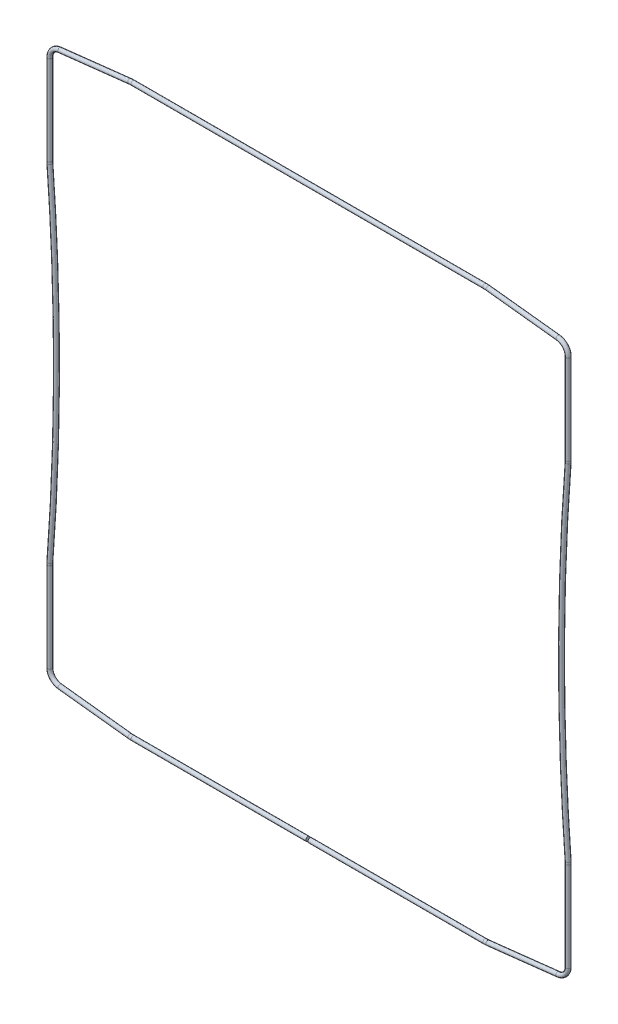
ISO-10303-21;
HEADER;
FILE_DESCRIPTION(('STEP AP214'),'2;1');
FILE_NAME('part.step','',(''),(''),'','','');
FILE_SCHEMA(('AUTOMOTIVE_DESIGN { 1 0 10303 214 1 1 1 1 }'));
ENDSEC;
DATA;
#1=APPLICATION_CONTEXT('core data for automotive mechanical design processes');
#2=APPLICATION_PROTOCOL_DEFINITION('international standard','automotive_design',2000,#1);
#3=PRODUCT_CONTEXT('',#1,'mechanical');
#4=PRODUCT('Part','Part','',(#3));
#5=PRODUCT_RELATED_PRODUCT_CATEGORY('part','',(#4));
#6=PRODUCT_DEFINITION_FORMATION('','',#4);
#7=PRODUCT_DEFINITION_CONTEXT('part definition',#1,'design');
#8=PRODUCT_DEFINITION('design','',#6,#7);
#9=PRODUCT_DEFINITION_SHAPE('','',#8);
#10=(LENGTH_UNIT() NAMED_UNIT(*) SI_UNIT(.MILLI.,.METRE.));
#11=(NAMED_UNIT(*) PLANE_ANGLE_UNIT() SI_UNIT($,.RADIAN.));
#12=(NAMED_UNIT(*) SI_UNIT($,.STERADIAN.) SOLID_ANGLE_UNIT());
#13=UNCERTAINTY_MEASURE_WITH_UNIT(LENGTH_MEASURE(1.E-05),#10,'distance_accuracy_value','');
#14=(GEOMETRIC_REPRESENTATION_CONTEXT(3) GLOBAL_UNCERTAINTY_ASSIGNED_CONTEXT((#13)) GLOBAL_UNIT_ASSIGNED_CONTEXT((#10,
#11,#12)) REPRESENTATION_CONTEXT('',''));
#15=CARTESIAN_POINT('',(0.,0.,0.));
#16=DIRECTION('',(0.,0.,1.));
#17=DIRECTION('',(1.,0.,0.));
#18=AXIS2_PLACEMENT_3D('',#15,#16,#17);
#19=CARTESIAN_POINT('',(0.254000000000032,-67.6148,0.));
#20=DIRECTION('',(1.,0.,0.));
#21=DIRECTION('',(0.,1.,0.));
#22=AXIS2_PLACEMENT_3D('',#19,#20,#21);
#23=PLANE('',#22);
#24=CARTESIAN_POINT('',(0.254000000000032,-67.6148,0.));
#25=DIRECTION('',(-1.,0.,0.));
#26=DIRECTION('',(0.,0.,1.));
#27=AXIS2_PLACEMENT_3D('',#24,#25,#26);
#28=CIRCLE('',#27,0.508000000000008);
#29=CARTESIAN_POINT('',(0.254000000000032,-67.6148,0.508000000000008));
#30=VERTEX_POINT('',#29);
#31=EDGE_CURVE('E19',#30,#30,#28,.F.);
#32=ORIENTED_EDGE('',*,*,#31,.F.);
#33=EDGE_LOOP('',(#32));
#34=FACE_BOUND('',#33,.T.);
#35=ADVANCED_FACE('F15',(#34),#23,.F.);
#36=CARTESIAN_POINT('',(-0.253999999999983,-67.6148,0.));
#37=DIRECTION('',(1.,0.,0.));
#38=DIRECTION('',(0.,0.,-1.));
#39=AXIS2_PLACEMENT_3D('',#36,#37,#38);
#40=PLANE('',#39);
#41=CARTESIAN_POINT('',(-0.253999999999983,-67.6148,0.));
#42=DIRECTION('',(1.,0.,0.));
#43=DIRECTION('',(0.,0.,-1.));
#44=AXIS2_PLACEMENT_3D('',#41,#42,#43);
#45=CIRCLE('',#44,0.508000000000008);
#46=CARTESIAN_POINT('',(-0.253999999999983,-67.6148,-0.508000000000008));
#47=VERTEX_POINT('',#46);
#48=EDGE_CURVE('E106',#47,#47,#45,.F.);
#49=ORIENTED_EDGE('',*,*,#48,.F.);
#50=EDGE_LOOP('',(#49));
#51=FACE_BOUND('',#50,.T.);
#52=ADVANCED_FACE('F121',(#51),#40,.T.);
#53=CARTESIAN_POINT('',(41.91,-67.6148,0.));
#54=DIRECTION('',(-1.,0.,0.));
#55=DIRECTION('',(0.,0.,1.));
#56=AXIS2_PLACEMENT_3D('',#53,#54,#55);
#57=CYLINDRICAL_SURFACE('',#56,0.508000000000008);
#58=ORIENTED_EDGE('',*,*,#31,.T.);
#59=EDGE_LOOP('',(#58));
#60=FACE_BOUND('',#59,.T.);
#61=CARTESIAN_POINT('',(41.91,-67.6148000000003,0.));
#62=DIRECTION('',(1.,0.,0.));
#63=DIRECTION('',(0.,1.,0.));
#64=AXIS2_PLACEMENT_3D('',#61,#62,#63);
#65=CIRCLE('',#64,0.507999999999995);
#66=CARTESIAN_POINT('',(41.91,-67.1068000000003,0.));
#67=VERTEX_POINT('',#66);
#68=EDGE_CURVE('E103',#67,#67,#65,.T.);
#69=ORIENTED_EDGE('',*,*,#68,.F.);
#70=EDGE_LOOP('',(#69));
#71=FACE_BOUND('',#70,.T.);
#72=ADVANCED_FACE('F117',(#60,#71),#57,.T.);
#73=CARTESIAN_POINT('',(-41.91,-67.6148,0.));
#74=DIRECTION('',(1.,0.,0.));
#75=DIRECTION('',(0.,0.,-1.));
#76=AXIS2_PLACEMENT_3D('',#73,#74,#75);
#77=CYLINDRICAL_SURFACE('',#76,0.508000000000008);
#78=CARTESIAN_POINT('',(-41.91,-67.6148,0.));
#79=DIRECTION('',(-1.,0.,0.));
#80=DIRECTION('',(0.,-1.,0.));
#81=AXIS2_PLACEMENT_3D('',#78,#79,#80);
#82=CIRCLE('',#81,0.507999999999995);
#83=CARTESIAN_POINT('',(-41.9099999999999,-68.1228,0.));
#84=VERTEX_POINT('',#83);
#85=EDGE_CURVE('E99',#84,#84,#82,.T.);
#86=ORIENTED_EDGE('',*,*,#85,.F.);
#87=EDGE_LOOP('',(#86));
#88=FACE_BOUND('',#87,.T.);
#89=ORIENTED_EDGE('',*,*,#48,.T.);
#90=EDGE_LOOP('',(#89));
#91=FACE_BOUND('',#90,.T.);
#92=ADVANCED_FACE('F180',(#88,#91),#77,.T.);
#93=CARTESIAN_POINT('',(41.91,-60.7059999999995,0.));
#94=DIRECTION('',(0.,0.,-1.));
#95=DIRECTION('',(-1.,0.,0.));
#96=AXIS2_PLACEMENT_3D('',#93,#94,#95);
#97=TOROIDAL_SURFACE('',#96,6.90880000000081,0.508);
#98=CARTESIAN_POINT('',(42.6834350092516,-67.5713707639478,0.));
#99=DIRECTION('',(-0.993713924841859,-0.111949254465532,0.));
#100=DIRECTION('',(0.111949254465532,-0.993713924841859,0.));
#101=AXIS2_PLACEMENT_3D('',#98,#99,#100);
#102=CIRCLE('',#101,0.507999999999999);
#103=CARTESIAN_POINT('',(42.7403052305201,-68.0761774377674,0.));
#104=VERTEX_POINT('',#103);
#105=EDGE_CURVE('E96',#104,#104,#102,.F.);
#106=ORIENTED_EDGE('',*,*,#105,.F.);
#107=EDGE_LOOP('',(#106));
#108=FACE_BOUND('',#107,.T.);
#109=ORIENTED_EDGE('',*,*,#68,.T.);
#110=EDGE_LOOP('',(#109));
#111=FACE_BOUND('',#110,.T.);
#112=ADVANCED_FACE('F183',(#108,#111),#97,.T.);
#113=CARTESIAN_POINT('',(-41.9100000000007,-60.7060000000069,0.));
#114=DIRECTION('',(0.,0.,-1.));
#115=DIRECTION('',(-1.,0.,0.));
#116=AXIS2_PLACEMENT_3D('',#113,#114,#115);
#117=TOROIDAL_SURFACE('',#116,6.90879999999313,0.507999999999995);
#118=CARTESIAN_POINT('',(-42.6834350092515,-67.5713707639475,0.));
#119=DIRECTION('',(-0.993713924841859,0.111949254465532,0.));
#120=DIRECTION('',(-0.111949254465532,-0.993713924841859,0.));
#121=AXIS2_PLACEMENT_3D('',#118,#119,#120);
#122=CIRCLE('',#121,0.507999999999999);
#123=CARTESIAN_POINT('',(-42.74030523052,-68.0761774377671,0.));
#124=VERTEX_POINT('',#123);
#125=EDGE_CURVE('E92',#124,#124,#122,.T.);
#126=CARTESIAN_POINT('',(-41.9100000000007,-60.7060000000069,0.));
#127=DIRECTION('',(0.,0.,-1.));
#128=DIRECTION('',(-1.,0.,0.));
#129=AXIS2_PLACEMENT_3D('',#126,#127,#128);
#130=CIRCLE('',#129,7.41679999999312);
#131=EDGE_CURVE('',#84,#124,#130,.T.);
#132=ORIENTED_EDGE('',*,*,#85,.T.);
#133=ORIENTED_EDGE('',*,*,#125,.F.);
#134=ORIENTED_EDGE('',*,*,#131,.T.);
#135=ORIENTED_EDGE('',*,*,#131,.F.);
#136=EDGE_LOOP('',(#132,#134,#133,#135));
#137=FACE_BOUND('',#136,.T.);
#138=ADVANCED_FACE('F178',(#137),#117,.T.);
#139=CARTESIAN_POINT('',(59.3592556837865,-65.6927157049355,0.));
#140=DIRECTION('',(-0.993713924841859,-0.111949254465532,0.));
#141=DIRECTION('',(0.111949254465532,-0.993713924841859,0.));
#142=AXIS2_PLACEMENT_3D('',#139,#140,#141);
#143=CYLINDRICAL_SURFACE('',#142,0.507999999999999);
#144=CARTESIAN_POINT('',(59.3592556837865,-65.6927157049355,0.));
#145=DIRECTION('',(0.993713924841858,0.111949254465539,0.));
#146=DIRECTION('',(-0.111949254465532,0.993713924841859,0.));
#147=AXIS2_PLACEMENT_3D('',#144,#145,#146);
#148=CIRCLE('',#147,0.507999999999999);
#149=CARTESIAN_POINT('',(59.416125905055,-66.1975223787552,0.));
#150=VERTEX_POINT('',#149);
#151=EDGE_CURVE('E88',#150,#150,#148,.T.);
#152=ORIENTED_EDGE('',*,*,#151,.F.);
#153=EDGE_LOOP('',(#152));
#154=FACE_BOUND('',#153,.T.);
#155=ORIENTED_EDGE('',*,*,#105,.T.);
#156=EDGE_LOOP('',(#155));
#157=FACE_BOUND('',#156,.T.);
#158=ADVANCED_FACE('F174',(#154,#157),#143,.T.);
#159=CARTESIAN_POINT('',(-42.6834350092515,-67.5713707639475,0.));
#160=DIRECTION('',(-0.993713924841859,0.111949254465532,0.));
#161=DIRECTION('',(-0.111949254465532,-0.993713924841859,0.));
#162=AXIS2_PLACEMENT_3D('',#159,#160,#161);
#163=CYLINDRICAL_SURFACE('',#162,0.507999999999999);
#164=CARTESIAN_POINT('',(-59.3592556837864,-65.6927157049352,0.));
#165=DIRECTION('',(-0.99371392484186,0.111949254465519,0.));
#166=DIRECTION('',(-0.111949254465519,-0.99371392484186,0.));
#167=AXIS2_PLACEMENT_3D('',#164,#165,#166);
#168=CIRCLE('',#167,0.507999999999998);
#169=CARTESIAN_POINT('',(-59.4161259050549,-66.1975223787549,0.));
#170=VERTEX_POINT('',#169);
#171=EDGE_CURVE('E85',#170,#170,#168,.T.);
#172=ORIENTED_EDGE('',*,*,#171,.F.);
#173=EDGE_LOOP('',(#172));
#174=FACE_BOUND('',#173,.T.);
#175=ORIENTED_EDGE('',*,*,#125,.T.);
#176=EDGE_LOOP('',(#175));
#177=FACE_BOUND('',#176,.T.);
#178=ADVANCED_FACE('F170',(#174,#177),#163,.T.);
#179=CARTESIAN_POINT('',(-59.055,-62.992,0.));
#180=DIRECTION('',(0.,0.,-1.));
#181=DIRECTION('',(-1.,0.,0.));
#182=AXIS2_PLACEMENT_3D('',#179,#180,#181);
#183=TOROIDAL_SURFACE('',#182,2.71780000000003,0.507999999999998);
#184=CARTESIAN_POINT('',(-61.7728,-62.992,0.));
#185=DIRECTION('',(0.,1.,0.));
#186=DIRECTION('',(0.,0.,1.));
#187=AXIS2_PLACEMENT_3D('',#184,#185,#186);
#188=CIRCLE('',#187,0.508000000000002);
#189=CARTESIAN_POINT('',(-62.2808,-62.992,0.));
#190=VERTEX_POINT('',#189);
#191=EDGE_CURVE('E82',#190,#190,#188,.T.);
#192=CARTESIAN_POINT('',(-59.055,-62.992,0.));
#193=DIRECTION('',(0.,0.,-1.));
#194=DIRECTION('',(-1.,0.,0.));
#195=AXIS2_PLACEMENT_3D('',#192,#193,#194);
#196=CIRCLE('',#195,3.22580000000003);
#197=EDGE_CURVE('',#170,#190,#196,.T.);
#198=ORIENTED_EDGE('',*,*,#171,.T.);
#199=ORIENTED_EDGE('',*,*,#191,.F.);
#200=ORIENTED_EDGE('',*,*,#197,.T.);
#201=ORIENTED_EDGE('',*,*,#197,.F.);
#202=EDGE_LOOP('',(#198,#200,#199,#201));
#203=FACE_BOUND('',#202,.T.);
#204=ADVANCED_FACE('F173',(#203),#183,.T.);
#205=CARTESIAN_POINT('',(59.055,-62.992,0.));
#206=DIRECTION('',(0.,0.,-1.));
#207=DIRECTION('',(-1.,0.,0.));
#208=AXIS2_PLACEMENT_3D('',#205,#206,#207);
#209=TOROIDAL_SURFACE('',#208,2.71780000000031,0.507999999999998);
#210=CARTESIAN_POINT('',(61.7728,-62.992,0.));
#211=DIRECTION('',(0.,-1.,0.));
#212=DIRECTION('',(0.,0.,-1.));
#213=AXIS2_PLACEMENT_3D('',#210,#211,#212);
#214=CIRCLE('',#213,0.508000000000002);
#215=CARTESIAN_POINT('',(62.2808000000003,-62.992,0.));
#216=VERTEX_POINT('',#215);
#217=EDGE_CURVE('E78',#216,#216,#214,.F.);
#218=CARTESIAN_POINT('',(59.055,-62.992,0.));
#219=DIRECTION('',(0.,0.,-1.));
#220=DIRECTION('',(-1.,0.,0.));
#221=AXIS2_PLACEMENT_3D('',#218,#219,#220);
#222=CIRCLE('',#221,3.22580000000031);
#223=EDGE_CURVE('',#216,#150,#222,.T.);
#224=ORIENTED_EDGE('',*,*,#217,.F.);
#225=ORIENTED_EDGE('',*,*,#151,.T.);
#226=ORIENTED_EDGE('',*,*,#223,.T.);
#227=ORIENTED_EDGE('',*,*,#223,.F.);
#228=EDGE_LOOP('',(#224,#226,#225,#227));
#229=FACE_BOUND('',#228,.T.);
#230=ADVANCED_FACE('F168',(#229),#209,.T.);
#231=CARTESIAN_POINT('',(-61.7728,-62.992,0.));
#232=DIRECTION('',(0.,1.,0.));
#233=DIRECTION('',(0.,0.,1.));
#234=AXIS2_PLACEMENT_3D('',#231,#232,#233);
#235=CYLINDRICAL_SURFACE('',#234,0.508000000000002);
#236=ORIENTED_EDGE('',*,*,#191,.T.);
#237=EDGE_LOOP('',(#236));
#238=FACE_BOUND('',#237,.T.);
#239=CARTESIAN_POINT('',(-61.7728,-41.656,0.));
#240=DIRECTION('',(0.,1.,0.));
#241=DIRECTION('',(1.,0.,0.));
#242=AXIS2_PLACEMENT_3D('',#239,#240,#241);
#243=CIRCLE('',#242,0.508000000000005);
#244=CARTESIAN_POINT('',(-62.2808,-41.656,0.));
#245=VERTEX_POINT('',#244);
#246=EDGE_CURVE('E75',#245,#245,#243,.T.);
#247=ORIENTED_EDGE('',*,*,#246,.F.);
#248=EDGE_LOOP('',(#247));
#249=FACE_BOUND('',#248,.T.);
#250=ADVANCED_FACE('F164',(#238,#249),#235,.T.);
#251=CARTESIAN_POINT('',(61.7728,-41.656,0.));
#252=DIRECTION('',(0.,-1.,0.));
#253=DIRECTION('',(0.,0.,-1.));
#254=AXIS2_PLACEMENT_3D('',#251,#252,#253);
#255=CYLINDRICAL_SURFACE('',#254,0.508000000000002);
#256=ORIENTED_EDGE('',*,*,#217,.T.);
#257=EDGE_LOOP('',(#256));
#258=FACE_BOUND('',#257,.T.);
#259=CARTESIAN_POINT('',(61.7728000000002,-41.656,0.));
#260=DIRECTION('',(0.,1.,0.));
#261=DIRECTION('',(1.,0.,0.));
#262=AXIS2_PLACEMENT_3D('',#259,#260,#261);
#263=CIRCLE('',#262,0.508000000000002);
#264=CARTESIAN_POINT('',(62.2808000000002,-41.656,0.));
#265=VERTEX_POINT('',#264);
#266=EDGE_CURVE('E71',#265,#265,#263,.T.);
#267=ORIENTED_EDGE('',*,*,#266,.F.);
#268=EDGE_LOOP('',(#267));
#269=FACE_BOUND('',#268,.T.);
#270=ADVANCED_FACE('F160',(#258,#269),#255,.T.);
#271=CARTESIAN_POINT('',(-54.8639999999933,-41.656,0.));
#272=DIRECTION('',(0.,0.,-1.));
#273=DIRECTION('',(-1.,0.,0.));
#274=AXIS2_PLACEMENT_3D('',#271,#272,#273);
#275=TOROIDAL_SURFACE('',#274,6.90880000000668,0.508000000000005);
#276=CARTESIAN_POINT('',(-61.752434802068,-41.1259213099415,0.));
#277=DIRECTION('',(0.0767251461988419,0.997052281448052,0.));
#278=DIRECTION('',(0.997052281448053,-0.0767251461988346,0.));
#279=AXIS2_PLACEMENT_3D('',#276,#277,#278);
#280=CIRCLE('',#279,0.507999999999997);
#281=CARTESIAN_POINT('',(-62.2589373610439,-41.0869449356725,0.));
#282=VERTEX_POINT('',#281);
#283=EDGE_CURVE('E68',#282,#282,#280,.T.);
#284=CARTESIAN_POINT('',(-54.8639999999933,-41.656,0.));
#285=DIRECTION('',(0.,0.,-1.));
#286=DIRECTION('',(-1.,0.,0.));
#287=AXIS2_PLACEMENT_3D('',#284,#285,#286);
#288=CIRCLE('',#287,7.41680000000669);
#289=EDGE_CURVE('',#245,#282,#288,.T.);
#290=ORIENTED_EDGE('',*,*,#246,.T.);
#291=ORIENTED_EDGE('',*,*,#283,.F.);
#292=ORIENTED_EDGE('',*,*,#289,.T.);
#293=ORIENTED_EDGE('',*,*,#289,.F.);
#294=EDGE_LOOP('',(#290,#292,#291,#293));
#295=FACE_BOUND('',#294,.T.);
#296=ADVANCED_FACE('F163',(#295),#275,.T.);
#297=CARTESIAN_POINT('',(54.8639999999947,-41.656,0.));
#298=DIRECTION('',(0.,0.,-1.));
#299=DIRECTION('',(-1.,0.,0.));
#300=AXIS2_PLACEMENT_3D('',#297,#298,#299);
#301=TOROIDAL_SURFACE('',#300,6.90880000000547,0.507999999999996);
#302=CARTESIAN_POINT('',(61.7524348020682,-41.1259213099409,0.));
#303=DIRECTION('',(-0.0767251461988284,0.997052281448053,0.));
#304=DIRECTION('',(0.997052281448053,0.0767251461988346,0.));
#305=AXIS2_PLACEMENT_3D('',#302,#303,#304);
#306=CIRCLE('',#305,0.507999999999997);
#307=CARTESIAN_POINT('',(62.2589373610441,-41.0869449356719,0.));
#308=VERTEX_POINT('',#307);
#309=EDGE_CURVE('E64',#308,#308,#306,.T.);
#310=CARTESIAN_POINT('',(54.8639999999947,-41.656,0.));
#311=DIRECTION('',(0.,0.,-1.));
#312=DIRECTION('',(-1.,0.,0.));
#313=AXIS2_PLACEMENT_3D('',#310,#311,#312);
#314=CIRCLE('',#313,7.41680000000547);
#315=EDGE_CURVE('',#308,#265,#314,.T.);
#316=ORIENTED_EDGE('',*,*,#309,.F.);
#317=ORIENTED_EDGE('',*,*,#266,.T.);
#318=ORIENTED_EDGE('',*,*,#315,.T.);
#319=ORIENTED_EDGE('',*,*,#315,.F.);
#320=EDGE_LOOP('',(#316,#318,#317,#319));
#321=FACE_BOUND('',#320,.T.);
#322=ADVANCED_FACE('F246',(#321),#301,.T.);
#323=CARTESIAN_POINT('',(596.188609905188,1.80411241501588E-13,0.));
#324=DIRECTION('',(0.,0.,1.));
#325=DIRECTION('',(1.,0.,0.));
#326=AXIS2_PLACEMENT_3D('',#323,#324,#325);
#327=TOROIDAL_SURFACE('',#326,536.016200000004,0.508);
#328=CARTESIAN_POINT('',(61.7524348020685,41.1259213099415,0.));
#329=DIRECTION('',(0.0767251461988127,0.997052281448055,0.));
#330=DIRECTION('',(0.997052281448054,-0.07672514619882,0.));
#331=AXIS2_PLACEMENT_3D('',#328,#329,#330);
#332=CIRCLE('',#331,0.508000000000003);
#333=CARTESIAN_POINT('',(62.2589373610441,41.0869449356726,0.));
#334=VERTEX_POINT('',#333);
#335=EDGE_CURVE('E61',#334,#334,#332,.T.);
#336=ORIENTED_EDGE('',*,*,#335,.F.);
#337=EDGE_LOOP('',(#336));
#338=FACE_BOUND('',#337,.T.);
#339=ORIENTED_EDGE('',*,*,#309,.T.);
#340=EDGE_LOOP('',(#339));
#341=FACE_BOUND('',#340,.T.);
#342=ADVANCED_FACE('F254',(#338,#341),#327,.T.);
#343=CARTESIAN_POINT('',(54.8639999999894,41.656,0.));
#344=DIRECTION('',(0.,0.,-1.));
#345=DIRECTION('',(-1.,0.,0.));
#346=AXIS2_PLACEMENT_3D('',#343,#344,#345);
#347=TOROIDAL_SURFACE('',#346,6.90880000001078,0.508000000000002);
#348=CARTESIAN_POINT('',(61.7728,41.656,0.));
#349=DIRECTION('',(0.,-1.,0.));
#350=DIRECTION('',(0.,0.,-1.));
#351=AXIS2_PLACEMENT_3D('',#348,#349,#350);
#352=CIRCLE('',#351,0.508000000000002);
#353=CARTESIAN_POINT('',(62.2808000000002,41.656,0.));
#354=VERTEX_POINT('',#353);
#355=EDGE_CURVE('E58',#354,#354,#352,.F.);
#356=CARTESIAN_POINT('',(54.8639999999894,41.656,0.));
#357=DIRECTION('',(0.,0.,-1.));
#358=DIRECTION('',(-1.,0.,0.));
#359=AXIS2_PLACEMENT_3D('',#356,#357,#358);
#360=CIRCLE('',#359,7.41680000001078);
#361=EDGE_CURVE('',#354,#334,#360,.T.);
#362=ORIENTED_EDGE('',*,*,#355,.F.);
#363=ORIENTED_EDGE('',*,*,#335,.T.);
#364=ORIENTED_EDGE('',*,*,#361,.T.);
#365=ORIENTED_EDGE('',*,*,#361,.F.);
#366=EDGE_LOOP('',(#362,#364,#363,#365));
#367=FACE_BOUND('',#366,.T.);
#368=ADVANCED_FACE('F263',(#367),#347,.T.);
#369=CARTESIAN_POINT('',(-596.188609905182,-2.77738187370413E-13,0.));
#370=DIRECTION('',(0.,0.,1.));
#371=DIRECTION('',(1.,0.,0.));
#372=AXIS2_PLACEMENT_3D('',#369,#370,#371);
#373=TOROIDAL_SURFACE('',#372,536.016199999999,0.507999999999998);
#374=ORIENTED_EDGE('',*,*,#283,.T.);
#375=EDGE_LOOP('',(#374));
#376=FACE_BOUND('',#375,.T.);
#377=CARTESIAN_POINT('',(-61.7524348020683,41.1259213099413,0.));
#378=DIRECTION('',(-0.0767251461988612,0.997052281448051,0.));
#379=DIRECTION('',(-0.997052281448051,-0.0767251461988618,0.));
#380=AXIS2_PLACEMENT_3D('',#377,#378,#379);
#381=CIRCLE('',#380,0.507999999999998);
#382=CARTESIAN_POINT('',(-62.2589373610439,41.0869449356723,0.));
#383=VERTEX_POINT('',#382);
#384=EDGE_CURVE('E54',#383,#383,#381,.T.);
#385=ORIENTED_EDGE('',*,*,#384,.F.);
#386=EDGE_LOOP('',(#385));
#387=FACE_BOUND('',#386,.T.);
#388=ADVANCED_FACE('F158',(#376,#387),#373,.T.);
#389=CARTESIAN_POINT('',(61.7728,62.992,0.));
#390=DIRECTION('',(0.,-1.,0.));
#391=DIRECTION('',(0.,0.,-1.));
#392=AXIS2_PLACEMENT_3D('',#389,#390,#391);
#393=CYLINDRICAL_SURFACE('',#392,0.508000000000002);
#394=CARTESIAN_POINT('',(61.7728000000002,62.992,0.));
#395=DIRECTION('',(0.,1.,0.));
#396=DIRECTION('',(-1.,0.,0.));
#397=AXIS2_PLACEMENT_3D('',#394,#395,#396);
#398=CIRCLE('',#397,0.508000000000002);
#399=CARTESIAN_POINT('',(62.2808000000002,62.992,0.));
#400=VERTEX_POINT('',#399);
#401=EDGE_CURVE('E51',#400,#400,#398,.T.);
#402=ORIENTED_EDGE('',*,*,#401,.F.);
#403=EDGE_LOOP('',(#402));
#404=FACE_BOUND('',#403,.T.);
#405=ORIENTED_EDGE('',*,*,#355,.T.);
#406=EDGE_LOOP('',(#405));
#407=FACE_BOUND('',#406,.T.);
#408=ADVANCED_FACE('F155',(#404,#407),#393,.T.);
#409=CARTESIAN_POINT('',(-54.8640000000033,41.6559999999997,0.));
#410=DIRECTION('',(0.,0.,-1.));
#411=DIRECTION('',(-1.,0.,0.));
#412=AXIS2_PLACEMENT_3D('',#409,#410,#411);
#413=TOROIDAL_SURFACE('',#412,6.90879999999671,0.507999999999998);
#414=CARTESIAN_POINT('',(-61.7728,41.656,0.));
#415=DIRECTION('',(0.,1.,0.));
#416=DIRECTION('',(0.,0.,1.));
#417=AXIS2_PLACEMENT_3D('',#414,#415,#416);
#418=CIRCLE('',#417,0.508000000000002);
#419=CARTESIAN_POINT('',(-62.2808,41.656,0.));
#420=VERTEX_POINT('',#419);
#421=EDGE_CURVE('E47',#420,#420,#418,.T.);
#422=CARTESIAN_POINT('',(-54.8640000000033,41.6559999999997,0.));
#423=DIRECTION('',(0.,0.,-1.));
#424=DIRECTION('',(-1.,0.,0.));
#425=AXIS2_PLACEMENT_3D('',#422,#423,#424);
#426=CIRCLE('',#425,7.41679999999671);
#427=EDGE_CURVE('',#383,#420,#426,.T.);
#428=ORIENTED_EDGE('',*,*,#384,.T.);
#429=ORIENTED_EDGE('',*,*,#421,.F.);
#430=ORIENTED_EDGE('',*,*,#427,.T.);
#431=ORIENTED_EDGE('',*,*,#427,.F.);
#432=EDGE_LOOP('',(#428,#430,#429,#431));
#433=FACE_BOUND('',#432,.T.);
#434=ADVANCED_FACE('F153',(#433),#413,.T.);
#435=CARTESIAN_POINT('',(-61.7728,41.656,0.));
#436=DIRECTION('',(0.,1.,0.));
#437=DIRECTION('',(0.,0.,1.));
#438=AXIS2_PLACEMENT_3D('',#435,#436,#437);
#439=CYLINDRICAL_SURFACE('',#438,0.508000000000002);
#440=CARTESIAN_POINT('',(-61.7728000000002,62.992,0.));
#441=DIRECTION('',(0.,1.,0.));
#442=DIRECTION('',(-1.,0.,0.));
#443=AXIS2_PLACEMENT_3D('',#440,#441,#442);
#444=CIRCLE('',#443,0.508000000000002);
#445=CARTESIAN_POINT('',(-62.2808000000002,62.992,0.));
#446=VERTEX_POINT('',#445);
#447=EDGE_CURVE('E44',#446,#446,#444,.T.);
#448=ORIENTED_EDGE('',*,*,#447,.F.);
#449=EDGE_LOOP('',(#448));
#450=FACE_BOUND('',#449,.T.);
#451=ORIENTED_EDGE('',*,*,#421,.T.);
#452=EDGE_LOOP('',(#451));
#453=FACE_BOUND('',#452,.T.);
#454=ADVANCED_FACE('F149',(#450,#453),#439,.T.);
#455=CARTESIAN_POINT('',(59.055,62.992,0.));
#456=DIRECTION('',(0.,0.,-1.));
#457=DIRECTION('',(-1.,0.,0.));
#458=AXIS2_PLACEMENT_3D('',#455,#456,#457);
#459=TOROIDAL_SURFACE('',#458,2.71780000000018,0.508);
#460=CARTESIAN_POINT('',(59.3592556837865,65.6927157049353,0.));
#461=DIRECTION('',(0.993713924841859,-0.111949254465532,0.));
#462=DIRECTION('',(0.111949254465532,0.993713924841859,0.));
#463=AXIS2_PLACEMENT_3D('',#460,#461,#462);
#464=CIRCLE('',#463,0.507999999999999);
#465=CARTESIAN_POINT('',(59.416125905055,66.197522378755,0.));
#466=VERTEX_POINT('',#465);
#467=EDGE_CURVE('E41',#466,#466,#464,.F.);
#468=CARTESIAN_POINT('',(59.055,62.992,0.));
#469=DIRECTION('',(0.,0.,-1.));
#470=DIRECTION('',(-1.,0.,0.));
#471=AXIS2_PLACEMENT_3D('',#468,#469,#470);
#472=CIRCLE('',#471,3.22580000000018);
#473=EDGE_CURVE('',#466,#400,#472,.T.);
#474=ORIENTED_EDGE('',*,*,#467,.F.);
#475=ORIENTED_EDGE('',*,*,#401,.T.);
#476=ORIENTED_EDGE('',*,*,#473,.T.);
#477=ORIENTED_EDGE('',*,*,#473,.F.);
#478=EDGE_LOOP('',(#474,#476,#475,#477));
#479=FACE_BOUND('',#478,.T.);
#480=ADVANCED_FACE('F152',(#479),#459,.T.);
#481=CARTESIAN_POINT('',(-59.055,62.992,0.));
#482=DIRECTION('',(0.,0.,-1.));
#483=DIRECTION('',(-1.,0.,0.));
#484=AXIS2_PLACEMENT_3D('',#481,#482,#483);
#485=TOROIDAL_SURFACE('',#484,2.71780000000015,0.508000000000002);
#486=CARTESIAN_POINT('',(-59.3592556837865,65.6927157049353,0.));
#487=DIRECTION('',(0.993713924841859,0.111949254465532,0.));
#488=DIRECTION('',(-0.111949254465532,0.993713924841859,0.));
#489=AXIS2_PLACEMENT_3D('',#486,#487,#488);
#490=CIRCLE('',#489,0.507999999999999);
#491=CARTESIAN_POINT('',(-59.416125905055,66.1975223787551,0.));
#492=VERTEX_POINT('',#491);
#493=EDGE_CURVE('E38',#492,#492,#490,.T.);
#494=CARTESIAN_POINT('',(-59.055,62.992,0.));
#495=DIRECTION('',(0.,0.,-1.));
#496=DIRECTION('',(-1.,0.,0.));
#497=AXIS2_PLACEMENT_3D('',#494,#495,#496);
#498=CIRCLE('',#497,3.22580000000015);
#499=EDGE_CURVE('',#446,#492,#498,.T.);
#500=ORIENTED_EDGE('',*,*,#447,.T.);
#501=ORIENTED_EDGE('',*,*,#493,.F.);
#502=ORIENTED_EDGE('',*,*,#499,.T.);
#503=ORIENTED_EDGE('',*,*,#499,.F.);
#504=EDGE_LOOP('',(#500,#502,#501,#503));
#505=FACE_BOUND('',#504,.T.);
#506=ADVANCED_FACE('F147',(#505),#485,.T.);
#507=CARTESIAN_POINT('',(42.6834350092515,67.5713707639476,0.));
#508=DIRECTION('',(0.993713924841859,-0.111949254465532,0.));
#509=DIRECTION('',(0.111949254465532,0.993713924841859,0.));
#510=AXIS2_PLACEMENT_3D('',#507,#508,#509);
#511=CYLINDRICAL_SURFACE('',#510,0.507999999999999);
#512=CARTESIAN_POINT('',(42.6834350092515,67.5713707639476,0.));
#513=DIRECTION('',(-0.993713924841859,0.111949254465532,0.));
#514=DIRECTION('',(-0.111949254465535,-0.993713924841859,0.));
#515=AXIS2_PLACEMENT_3D('',#512,#513,#514);
#516=CIRCLE('',#515,0.507999999999992);
#517=CARTESIAN_POINT('',(42.74030523052,68.0761774377673,0.));
#518=VERTEX_POINT('',#517);
#519=EDGE_CURVE('E35',#518,#518,#516,.T.);
#520=ORIENTED_EDGE('',*,*,#519,.F.);
#521=EDGE_LOOP('',(#520));
#522=FACE_BOUND('',#521,.T.);
#523=ORIENTED_EDGE('',*,*,#467,.T.);
#524=EDGE_LOOP('',(#523));
#525=FACE_BOUND('',#524,.T.);
#526=ADVANCED_FACE('F143',(#522,#525),#511,.T.);
#527=CARTESIAN_POINT('',(-59.3592556837865,65.6927157049353,0.));
#528=DIRECTION('',(0.993713924841859,0.111949254465532,0.));
#529=DIRECTION('',(-0.111949254465532,0.993713924841859,0.));
#530=AXIS2_PLACEMENT_3D('',#527,#528,#529);
#531=CYLINDRICAL_SURFACE('',#530,0.507999999999999);
#532=ORIENTED_EDGE('',*,*,#493,.T.);
#533=EDGE_LOOP('',(#532));
#534=FACE_BOUND('',#533,.T.);
#535=CARTESIAN_POINT('',(-42.6834350092515,67.5713707639476,0.));
#536=DIRECTION('',(0.993713924841858,0.111949254465537,0.));
#537=DIRECTION('',(0.111949254465546,-0.993713924841857,0.));
#538=AXIS2_PLACEMENT_3D('',#535,#536,#537);
#539=CIRCLE('',#538,0.508);
#540=CARTESIAN_POINT('',(-42.74030523052,68.0761774377673,0.));
#541=VERTEX_POINT('',#540);
#542=EDGE_CURVE('E29',#541,#541,#539,.T.);
#543=ORIENTED_EDGE('',*,*,#542,.F.);
#544=EDGE_LOOP('',(#543));
#545=FACE_BOUND('',#544,.T.);
#546=ADVANCED_FACE('F140',(#534,#545),#531,.T.);
#547=CARTESIAN_POINT('',(41.91,60.7059999999997,0.));
#548=DIRECTION('',(0.,0.,-1.));
#549=DIRECTION('',(-1.,0.,0.));
#550=AXIS2_PLACEMENT_3D('',#547,#548,#549);
#551=TOROIDAL_SURFACE('',#550,6.90880000000049,0.507999999999995);
#552=CARTESIAN_POINT('',(41.91,67.6148,0.));
#553=DIRECTION('',(1.,0.,0.));
#554=DIRECTION('',(0.,0.,-1.));
#555=AXIS2_PLACEMENT_3D('',#552,#553,#554);
#556=CIRCLE('',#555,0.508);
#557=CARTESIAN_POINT('',(41.91,68.1228000000002,0.));
#558=VERTEX_POINT('',#557);
#559=EDGE_CURVE('E10',#558,#558,#556,.F.);
#560=CARTESIAN_POINT('',(41.91,60.7059999999997,0.));
#561=DIRECTION('',(0.,0.,-1.));
#562=DIRECTION('',(-1.,0.,0.));
#563=AXIS2_PLACEMENT_3D('',#560,#561,#562);
#564=CIRCLE('',#563,7.41680000000049);
#565=EDGE_CURVE('',#558,#518,#564,.T.);
#566=ORIENTED_EDGE('',*,*,#559,.F.);
#567=ORIENTED_EDGE('',*,*,#519,.T.);
#568=ORIENTED_EDGE('',*,*,#565,.T.);
#569=ORIENTED_EDGE('',*,*,#565,.F.);
#570=EDGE_LOOP('',(#566,#568,#567,#569));
#571=FACE_BOUND('',#570,.T.);
#572=ADVANCED_FACE('F136',(#571),#551,.T.);
#573=CARTESIAN_POINT('',(-41.91,60.7059999999998,0.));
#574=DIRECTION('',(0.,0.,-1.));
#575=DIRECTION('',(-1.,0.,0.));
#576=AXIS2_PLACEMENT_3D('',#573,#574,#575);
#577=TOROIDAL_SURFACE('',#576,6.90880000000038,0.508);
#578=CARTESIAN_POINT('',(-41.91,67.6148,0.));
#579=DIRECTION('',(1.,0.,0.));
#580=DIRECTION('',(0.,0.,-1.));
#581=AXIS2_PLACEMENT_3D('',#578,#579,#580);
#582=CIRCLE('',#581,0.508);
#583=CARTESIAN_POINT('',(-41.91,68.1228000000002,0.));
#584=VERTEX_POINT('',#583);
#585=EDGE_CURVE('E23',#584,#584,#582,.T.);
#586=CARTESIAN_POINT('',(-41.91,60.7059999999998,0.));
#587=DIRECTION('',(0.,0.,-1.));
#588=DIRECTION('',(-1.,0.,0.));
#589=AXIS2_PLACEMENT_3D('',#586,#587,#588);
#590=CIRCLE('',#589,7.41680000000038);
#591=EDGE_CURVE('',#541,#584,#590,.T.);
#592=ORIENTED_EDGE('',*,*,#542,.T.);
#593=ORIENTED_EDGE('',*,*,#585,.F.);
#594=ORIENTED_EDGE('',*,*,#591,.T.);
#595=ORIENTED_EDGE('',*,*,#591,.F.);
#596=EDGE_LOOP('',(#592,#594,#593,#595));
#597=FACE_BOUND('',#596,.T.);
#598=ADVANCED_FACE('F17',(#597),#577,.T.);
#599=CARTESIAN_POINT('',(-41.91,67.6148,0.));
#600=DIRECTION('',(1.,0.,0.));
#601=DIRECTION('',(0.,0.,-1.));
#602=AXIS2_PLACEMENT_3D('',#599,#600,#601);
#603=CYLINDRICAL_SURFACE('',#602,0.508);
#604=ORIENTED_EDGE('',*,*,#559,.T.);
#605=EDGE_LOOP('',(#604));
#606=FACE_BOUND('',#605,.T.);
#607=ORIENTED_EDGE('',*,*,#585,.T.);
#608=EDGE_LOOP('',(#607));
#609=FACE_BOUND('',#608,.T.);
#610=ADVANCED_FACE('F130',(#606,#609),#603,.T.);
#611=CLOSED_SHELL('',(#35,#52,#72,#92,#112,#138,#158,#178,#204,#230,#250,#270,#296,#322,#342,
#368,#388,#408,#434,#454,#480,#506,#526,#546,#572,#598,#610));
#612=MANIFOLD_SOLID_BREP('B1',#611);
#613=ADVANCED_BREP_SHAPE_REPRESENTATION('',(#18,#612),#14);
#614=SHAPE_DEFINITION_REPRESENTATION(#9,#613);
ENDSEC;
END-ISO-10303-21;
